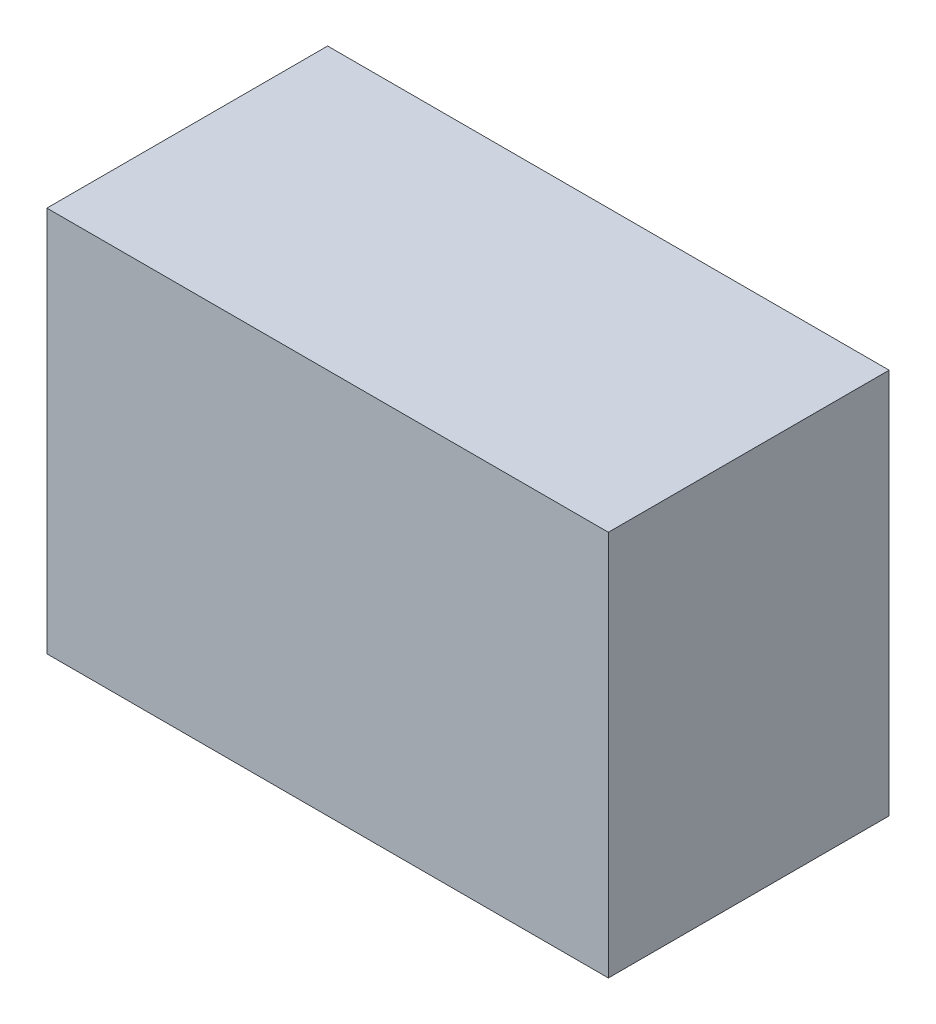
ISO-10303-21;
HEADER;
FILE_DESCRIPTION(('STEP AP214'),'2;1');
FILE_NAME('part.step','',(''),(''),'','','');
FILE_SCHEMA(('AUTOMOTIVE_DESIGN { 1 0 10303 214 1 1 1 1 }'));
ENDSEC;
DATA;
#1=APPLICATION_CONTEXT('core data for automotive mechanical design processes');
#2=APPLICATION_PROTOCOL_DEFINITION('international standard','automotive_design',2000,#1);
#3=PRODUCT_CONTEXT('',#1,'mechanical');
#4=PRODUCT('Part','Part','',(#3));
#5=PRODUCT_RELATED_PRODUCT_CATEGORY('part','',(#4));
#6=PRODUCT_DEFINITION_FORMATION('','',#4);
#7=PRODUCT_DEFINITION_CONTEXT('part definition',#1,'design');
#8=PRODUCT_DEFINITION('design','',#6,#7);
#9=PRODUCT_DEFINITION_SHAPE('','',#8);
#10=(LENGTH_UNIT() NAMED_UNIT(*) SI_UNIT(.MILLI.,.METRE.));
#11=(NAMED_UNIT(*) PLANE_ANGLE_UNIT() SI_UNIT($,.RADIAN.));
#12=(NAMED_UNIT(*) SI_UNIT($,.STERADIAN.) SOLID_ANGLE_UNIT());
#13=UNCERTAINTY_MEASURE_WITH_UNIT(LENGTH_MEASURE(1.E-05),#10,'distance_accuracy_value','');
#14=(GEOMETRIC_REPRESENTATION_CONTEXT(3) GLOBAL_UNCERTAINTY_ASSIGNED_CONTEXT((#13)) GLOBAL_UNIT_ASSIGNED_CONTEXT((#10,
#11,#12)) REPRESENTATION_CONTEXT('',''));
#15=CARTESIAN_POINT('',(0.,0.,0.));
#16=DIRECTION('',(0.,0.,1.));
#17=DIRECTION('',(1.,0.,0.));
#18=AXIS2_PLACEMENT_3D('',#15,#16,#17);
#19=CARTESIAN_POINT('',(0.,0.,8.));
#20=DIRECTION('',(-1.,0.,0.));
#21=DIRECTION('',(0.,-1.,0.));
#22=AXIS2_PLACEMENT_3D('',#19,#20,#21);
#23=PLANE('',#22);
#24=DIRECTION('',(0.,1.,0.));
#25=VECTOR('',#24,1.);
#26=CARTESIAN_POINT('',(0.,0.,0.));
#27=LINE('',#26,#25);
#28=CARTESIAN_POINT('',(0.,0.,0.));
#29=VERTEX_POINT('',#28);
#30=CARTESIAN_POINT('',(0.,11.,0.));
#31=VERTEX_POINT('',#30);
#32=EDGE_CURVE('E98',#29,#31,#27,.T.);
#33=ORIENTED_EDGE('',*,*,#32,.T.);
#34=DIRECTION('',(0.,0.,-1.));
#35=VECTOR('',#34,1.);
#36=CARTESIAN_POINT('',(0.,11.,8.));
#37=LINE('',#36,#35);
#38=CARTESIAN_POINT('',(0.,11.,8.));
#39=VERTEX_POINT('',#38);
#40=EDGE_CURVE('E11',#39,#31,#37,.T.);
#41=ORIENTED_EDGE('',*,*,#40,.F.);
#42=DIRECTION('',(0.,1.,0.));
#43=VECTOR('',#42,1.);
#44=CARTESIAN_POINT('',(0.,0.,8.));
#45=LINE('',#44,#43);
#46=CARTESIAN_POINT('',(0.,0.,8.));
#47=VERTEX_POINT('',#46);
#48=EDGE_CURVE('E86',#47,#39,#45,.T.);
#49=ORIENTED_EDGE('',*,*,#48,.F.);
#50=DIRECTION('',(0.,0.,-1.));
#51=VECTOR('',#50,1.);
#52=CARTESIAN_POINT('',(0.,0.,8.));
#53=LINE('',#52,#51);
#54=EDGE_CURVE('E94',#47,#29,#53,.T.);
#55=ORIENTED_EDGE('',*,*,#54,.T.);
#56=EDGE_LOOP('',(#33,#41,#49,#55));
#57=FACE_BOUND('',#56,.T.);
#58=ADVANCED_FACE('F35',(#57),#23,.F.);
#59=CARTESIAN_POINT('',(0.,11.,8.));
#60=DIRECTION('',(0.,-1.,0.));
#61=DIRECTION('',(0.,0.,-1.));
#62=AXIS2_PLACEMENT_3D('',#59,#60,#61);
#63=PLANE('',#62);
#64=DIRECTION('',(-1.,0.,0.));
#65=VECTOR('',#64,1.);
#66=CARTESIAN_POINT('',(0.,11.,0.));
#67=LINE('',#66,#65);
#68=CARTESIAN_POINT('',(-16.,11.,0.));
#69=VERTEX_POINT('',#68);
#70=EDGE_CURVE('E90',#31,#69,#67,.T.);
#71=ORIENTED_EDGE('',*,*,#70,.T.);
#72=DIRECTION('',(0.,0.,-1.));
#73=VECTOR('',#72,1.);
#74=CARTESIAN_POINT('',(-16.,11.,8.));
#75=LINE('',#74,#73);
#76=CARTESIAN_POINT('',(-16.,11.,8.));
#77=VERTEX_POINT('',#76);
#78=EDGE_CURVE('E43',#77,#69,#75,.T.);
#79=ORIENTED_EDGE('',*,*,#78,.F.);
#80=DIRECTION('',(-1.,0.,0.));
#81=VECTOR('',#80,1.);
#82=CARTESIAN_POINT('',(0.,11.,8.));
#83=LINE('',#82,#81);
#84=EDGE_CURVE('E81',#39,#77,#83,.T.);
#85=ORIENTED_EDGE('',*,*,#84,.F.);
#86=ORIENTED_EDGE('',*,*,#40,.T.);
#87=EDGE_LOOP('',(#71,#79,#85,#86));
#88=FACE_BOUND('',#87,.T.);
#89=ADVANCED_FACE('F89',(#88),#63,.F.);
#90=CARTESIAN_POINT('',(-16.,0.,8.));
#91=DIRECTION('',(1.,0.,0.));
#92=DIRECTION('',(0.,0.,-1.));
#93=AXIS2_PLACEMENT_3D('',#90,#91,#92);
#94=PLANE('',#93);
#95=DIRECTION('',(0.,-1.,0.));
#96=VECTOR('',#95,1.);
#97=CARTESIAN_POINT('',(-16.,0.,0.));
#98=LINE('',#97,#96);
#99=CARTESIAN_POINT('',(-16.,0.,0.));
#100=VERTEX_POINT('',#99);
#101=EDGE_CURVE('E68',#69,#100,#98,.T.);
#102=ORIENTED_EDGE('',*,*,#101,.T.);
#103=DIRECTION('',(0.,0.,-1.));
#104=VECTOR('',#103,1.);
#105=CARTESIAN_POINT('',(-16.,0.,8.));
#106=LINE('',#105,#104);
#107=CARTESIAN_POINT('',(-16.,0.,8.));
#108=VERTEX_POINT('',#107);
#109=EDGE_CURVE('E91',#108,#100,#106,.T.);
#110=ORIENTED_EDGE('',*,*,#109,.F.);
#111=DIRECTION('',(0.,-1.,0.));
#112=VECTOR('',#111,1.);
#113=CARTESIAN_POINT('',(-16.,0.,8.));
#114=LINE('',#113,#112);
#115=EDGE_CURVE('E84',#77,#108,#114,.T.);
#116=ORIENTED_EDGE('',*,*,#115,.F.);
#117=ORIENTED_EDGE('',*,*,#78,.T.);
#118=EDGE_LOOP('',(#102,#110,#116,#117));
#119=FACE_BOUND('',#118,.T.);
#120=ADVANCED_FACE('F92',(#119),#94,.F.);
#121=CARTESIAN_POINT('',(0.,0.,8.));
#122=DIRECTION('',(0.,1.,0.));
#123=DIRECTION('',(-1.,0.,0.));
#124=AXIS2_PLACEMENT_3D('',#121,#122,#123);
#125=PLANE('',#124);
#126=DIRECTION('',(1.,0.,0.));
#127=VECTOR('',#126,1.);
#128=CARTESIAN_POINT('',(0.,0.,0.));
#129=LINE('',#128,#127);
#130=EDGE_CURVE('E74',#100,#29,#129,.T.);
#131=ORIENTED_EDGE('',*,*,#130,.T.);
#132=ORIENTED_EDGE('',*,*,#54,.F.);
#133=DIRECTION('',(1.,0.,0.));
#134=VECTOR('',#133,1.);
#135=CARTESIAN_POINT('',(0.,0.,8.));
#136=LINE('',#135,#134);
#137=EDGE_CURVE('E51',#108,#47,#136,.T.);
#138=ORIENTED_EDGE('',*,*,#137,.F.);
#139=ORIENTED_EDGE('',*,*,#109,.T.);
#140=EDGE_LOOP('',(#131,#132,#138,#139));
#141=FACE_BOUND('',#140,.T.);
#142=ADVANCED_FACE('F105',(#141),#125,.F.);
#143=CARTESIAN_POINT('',(0.,0.,8.));
#144=DIRECTION('',(0.,0.,1.));
#145=DIRECTION('',(1.,0.,0.));
#146=AXIS2_PLACEMENT_3D('',#143,#144,#145);
#147=PLANE('',#146);
#148=ORIENTED_EDGE('',*,*,#48,.T.);
#149=ORIENTED_EDGE('',*,*,#84,.T.);
#150=ORIENTED_EDGE('',*,*,#115,.T.);
#151=ORIENTED_EDGE('',*,*,#137,.T.);
#152=EDGE_LOOP('',(#148,#149,#150,#151));
#153=FACE_BOUND('',#152,.T.);
#154=ADVANCED_FACE('F82',(#153),#147,.T.);
#155=CARTESIAN_POINT('',(0.,0.,0.));
#156=DIRECTION('',(0.,0.,1.));
#157=DIRECTION('',(1.,0.,0.));
#158=AXIS2_PLACEMENT_3D('',#155,#156,#157);
#159=PLANE('',#158);
#160=ORIENTED_EDGE('',*,*,#32,.F.);
#161=ORIENTED_EDGE('',*,*,#130,.F.);
#162=ORIENTED_EDGE('',*,*,#101,.F.);
#163=ORIENTED_EDGE('',*,*,#70,.F.);
#164=EDGE_LOOP('',(#160,#161,#162,#163));
#165=FACE_BOUND('',#164,.T.);
#166=ADVANCED_FACE('F108',(#165),#159,.F.);
#167=CLOSED_SHELL('',(#58,#89,#120,#142,#154,#166));
#168=MANIFOLD_SOLID_BREP('B2',#167);
#169=ADVANCED_BREP_SHAPE_REPRESENTATION('',(#18,#168),#14);
#170=SHAPE_DEFINITION_REPRESENTATION(#9,#169);
ENDSEC;
END-ISO-10303-21;
